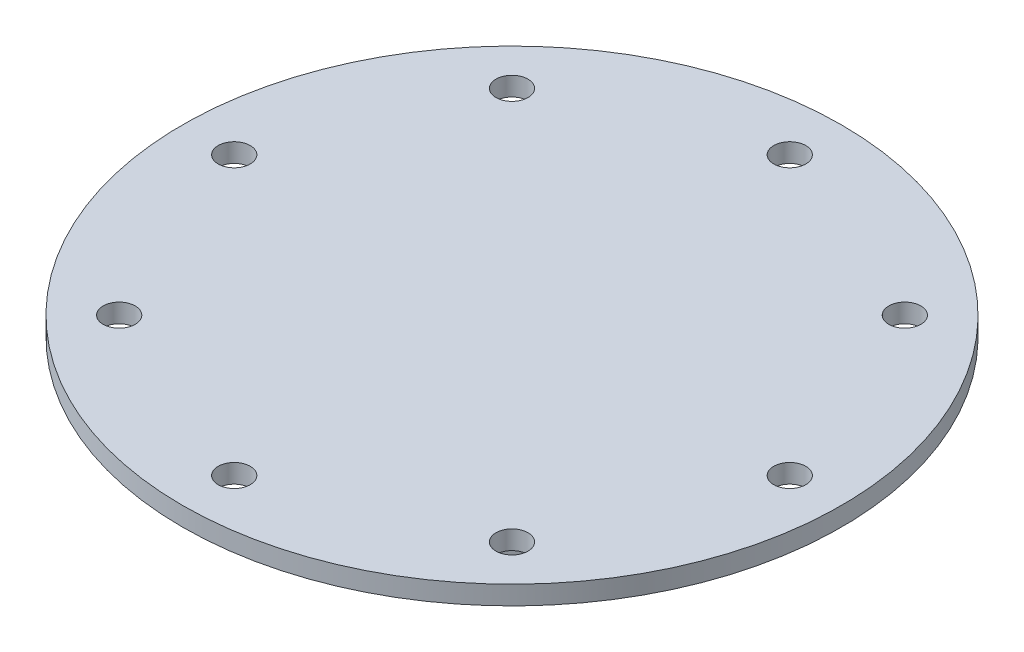
ISO-10303-21;
HEADER;
FILE_DESCRIPTION(('STEP AP214'),'2;1');
FILE_NAME('part.step','',(''),(''),'','','');
FILE_SCHEMA(('AUTOMOTIVE_DESIGN { 1 0 10303 214 1 1 1 1 }'));
ENDSEC;
DATA;
#1=APPLICATION_CONTEXT('core data for automotive mechanical design processes');
#2=APPLICATION_PROTOCOL_DEFINITION('international standard','automotive_design',2000,#1);
#3=PRODUCT_CONTEXT('',#1,'mechanical');
#4=PRODUCT('Part','Part','',(#3));
#5=PRODUCT_RELATED_PRODUCT_CATEGORY('part','',(#4));
#6=PRODUCT_DEFINITION_FORMATION('','',#4);
#7=PRODUCT_DEFINITION_CONTEXT('part definition',#1,'design');
#8=PRODUCT_DEFINITION('design','',#6,#7);
#9=PRODUCT_DEFINITION_SHAPE('','',#8);
#10=(LENGTH_UNIT() NAMED_UNIT(*) SI_UNIT(.MILLI.,.METRE.));
#11=(NAMED_UNIT(*) PLANE_ANGLE_UNIT() SI_UNIT($,.RADIAN.));
#12=(NAMED_UNIT(*) SI_UNIT($,.STERADIAN.) SOLID_ANGLE_UNIT());
#13=UNCERTAINTY_MEASURE_WITH_UNIT(LENGTH_MEASURE(1.E-05),#10,'distance_accuracy_value','');
#14=(GEOMETRIC_REPRESENTATION_CONTEXT(3) GLOBAL_UNCERTAINTY_ASSIGNED_CONTEXT((#13)) GLOBAL_UNIT_ASSIGNED_CONTEXT((#10,
#11,#12)) REPRESENTATION_CONTEXT('',''));
#15=CARTESIAN_POINT('',(0.,0.,0.));
#16=DIRECTION('',(0.,0.,1.));
#17=DIRECTION('',(1.,0.,0.));
#18=AXIS2_PLACEMENT_3D('',#15,#16,#17);
#19=CARTESIAN_POINT('',(0.,4.,0.));
#20=DIRECTION('',(0.,1.,0.));
#21=DIRECTION('',(0.,0.,1.));
#22=AXIS2_PLACEMENT_3D('',#19,#20,#21);
#23=PLANE('',#22);
#24=CARTESIAN_POINT('',(6.17992196975235E-13,4.,-59.));
#25=DIRECTION('',(0.,1.,0.));
#26=DIRECTION('',(0.,0.,1.));
#27=AXIS2_PLACEMENT_3D('',#24,#25,#26);
#28=CIRCLE('',#27,3.4);
#29=CARTESIAN_POINT('',(6.17992196975235E-13,4.,-55.6));
#30=VERTEX_POINT('',#29);
#31=EDGE_CURVE('E92',#30,#30,#28,.T.);
#32=ORIENTED_EDGE('',*,*,#31,.F.);
#33=EDGE_LOOP('',(#32));
#34=FACE_BOUND('',#33,.T.);
#35=CARTESIAN_POINT('',(-59.,4.,-4.1199479798349E-13));
#36=DIRECTION('',(0.,1.,0.));
#37=DIRECTION('',(0.,0.,1.));
#38=AXIS2_PLACEMENT_3D('',#35,#36,#37);
#39=CIRCLE('',#38,3.4);
#40=CARTESIAN_POINT('',(-59.,4.,3.39999999999959));
#41=VERTEX_POINT('',#40);
#42=EDGE_CURVE('E80',#41,#41,#39,.T.);
#43=ORIENTED_EDGE('',*,*,#42,.F.);
#44=EDGE_LOOP('',(#43));
#45=FACE_BOUND('',#44,.T.);
#46=CARTESIAN_POINT('',(-2.05997398991745E-13,4.,59.));
#47=DIRECTION('',(0.,1.,0.));
#48=DIRECTION('',(0.,0.,1.));
#49=AXIS2_PLACEMENT_3D('',#46,#47,#48);
#50=CIRCLE('',#49,3.4);
#51=CARTESIAN_POINT('',(-2.05997398991745E-13,4.,62.4));
#52=VERTEX_POINT('',#51);
#53=EDGE_CURVE('E68',#52,#52,#50,.T.);
#54=ORIENTED_EDGE('',*,*,#53,.F.);
#55=EDGE_LOOP('',(#54));
#56=FACE_BOUND('',#55,.T.);
#57=CARTESIAN_POINT('',(59.,4.,0.));
#58=DIRECTION('',(0.,1.,0.));
#59=DIRECTION('',(0.,0.,1.));
#60=AXIS2_PLACEMENT_3D('',#57,#58,#59);
#61=CIRCLE('',#60,3.4);
#62=CARTESIAN_POINT('',(59.,4.,3.4));
#63=VERTEX_POINT('',#62);
#64=EDGE_CURVE('E56',#63,#63,#61,.T.);
#65=ORIENTED_EDGE('',*,*,#64,.F.);
#66=EDGE_LOOP('',(#65));
#67=FACE_BOUND('',#66,.T.);
#68=CARTESIAN_POINT('',(0.,4.,0.));
#69=DIRECTION('',(0.,1.,0.));
#70=DIRECTION('',(0.,0.,1.));
#71=AXIS2_PLACEMENT_3D('',#68,#69,#70);
#72=CIRCLE('',#71,70.);
#73=CARTESIAN_POINT('',(0.,4.,70.));
#74=VERTEX_POINT('',#73);
#75=EDGE_CURVE('E52',#74,#74,#72,.T.);
#76=ORIENTED_EDGE('',*,*,#75,.T.);
#77=EDGE_LOOP('',(#76));
#78=FACE_BOUND('',#77,.T.);
#79=CARTESIAN_POINT('',(41.7193000900062,4.,41.7193000900064));
#80=DIRECTION('',(0.,1.,0.));
#81=DIRECTION('',(0.,0.,1.));
#82=AXIS2_PLACEMENT_3D('',#79,#80,#81);
#83=CIRCLE('',#82,3.4);
#84=CARTESIAN_POINT('',(41.7193000900062,4.,45.1193000900064));
#85=VERTEX_POINT('',#84);
#86=EDGE_CURVE('E62',#85,#85,#83,.T.);
#87=ORIENTED_EDGE('',*,*,#86,.F.);
#88=EDGE_LOOP('',(#87));
#89=FACE_BOUND('',#88,.T.);
#90=CARTESIAN_POINT('',(-41.7193000900065,4.,41.7193000900061));
#91=DIRECTION('',(0.,1.,0.));
#92=DIRECTION('',(0.,0.,1.));
#93=AXIS2_PLACEMENT_3D('',#90,#91,#92);
#94=CIRCLE('',#93,3.4);
#95=CARTESIAN_POINT('',(-41.7193000900065,4.,45.1193000900061));
#96=VERTEX_POINT('',#95);
#97=EDGE_CURVE('E74',#96,#96,#94,.T.);
#98=ORIENTED_EDGE('',*,*,#97,.F.);
#99=EDGE_LOOP('',(#98));
#100=FACE_BOUND('',#99,.T.);
#101=CARTESIAN_POINT('',(-41.7193000900059,4.,-41.7193000900067));
#102=DIRECTION('',(0.,1.,0.));
#103=DIRECTION('',(0.,0.,1.));
#104=AXIS2_PLACEMENT_3D('',#101,#102,#103);
#105=CIRCLE('',#104,3.4);
#106=CARTESIAN_POINT('',(-41.7193000900059,4.,-38.3193000900067));
#107=VERTEX_POINT('',#106);
#108=EDGE_CURVE('E86',#107,#107,#105,.T.);
#109=ORIENTED_EDGE('',*,*,#108,.F.);
#110=EDGE_LOOP('',(#109));
#111=FACE_BOUND('',#110,.T.);
#112=CARTESIAN_POINT('',(41.7193000900068,4.,-41.7193000900058));
#113=DIRECTION('',(0.,1.,0.));
#114=DIRECTION('',(0.,0.,1.));
#115=AXIS2_PLACEMENT_3D('',#112,#113,#114);
#116=CIRCLE('',#115,3.4);
#117=CARTESIAN_POINT('',(41.7193000900068,4.,-38.3193000900058));
#118=VERTEX_POINT('',#117);
#119=EDGE_CURVE('E98',#118,#118,#116,.T.);
#120=ORIENTED_EDGE('',*,*,#119,.F.);
#121=EDGE_LOOP('',(#120));
#122=FACE_BOUND('',#121,.T.);
#123=ADVANCED_FACE('F32',(#34,#45,#56,#67,#78,#89,#100,#111,#122),#23,.T.);
#124=CARTESIAN_POINT('',(0.,0.,0.));
#125=DIRECTION('',(0.,1.,0.));
#126=DIRECTION('',(0.,0.,1.));
#127=AXIS2_PLACEMENT_3D('',#124,#125,#126);
#128=PLANE('',#127);
#129=CARTESIAN_POINT('',(0.,0.,0.));
#130=DIRECTION('',(0.,1.,0.));
#131=DIRECTION('',(0.,0.,1.));
#132=AXIS2_PLACEMENT_3D('',#129,#130,#131);
#133=CIRCLE('',#132,41.);
#134=CARTESIAN_POINT('',(0.,0.,41.));
#135=VERTEX_POINT('',#134);
#136=EDGE_CURVE('E47',#135,#135,#133,.T.);
#137=ORIENTED_EDGE('',*,*,#136,.T.);
#138=EDGE_LOOP('',(#137));
#139=FACE_BOUND('',#138,.T.);
#140=CARTESIAN_POINT('',(0.,0.,0.));
#141=DIRECTION('',(0.,1.,0.));
#142=DIRECTION('',(0.,0.,1.));
#143=AXIS2_PLACEMENT_3D('',#140,#141,#142);
#144=CIRCLE('',#143,70.);
#145=CARTESIAN_POINT('',(0.,0.,70.));
#146=VERTEX_POINT('',#145);
#147=EDGE_CURVE('E53',#146,#146,#144,.T.);
#148=ORIENTED_EDGE('',*,*,#147,.F.);
#149=EDGE_LOOP('',(#148));
#150=FACE_BOUND('',#149,.T.);
#151=CARTESIAN_POINT('',(59.,0.,0.));
#152=DIRECTION('',(0.,1.,0.));
#153=DIRECTION('',(0.,0.,1.));
#154=AXIS2_PLACEMENT_3D('',#151,#152,#153);
#155=CIRCLE('',#154,3.4);
#156=CARTESIAN_POINT('',(59.,0.,3.4));
#157=VERTEX_POINT('',#156);
#158=EDGE_CURVE('E59',#157,#157,#155,.T.);
#159=ORIENTED_EDGE('',*,*,#158,.T.);
#160=EDGE_LOOP('',(#159));
#161=FACE_BOUND('',#160,.T.);
#162=CARTESIAN_POINT('',(41.7193000900062,0.,41.7193000900064));
#163=DIRECTION('',(0.,1.,0.));
#164=DIRECTION('',(0.,0.,1.));
#165=AXIS2_PLACEMENT_3D('',#162,#163,#164);
#166=CIRCLE('',#165,3.4);
#167=CARTESIAN_POINT('',(41.7193000900062,0.,45.1193000900064));
#168=VERTEX_POINT('',#167);
#169=EDGE_CURVE('E65',#168,#168,#166,.T.);
#170=ORIENTED_EDGE('',*,*,#169,.T.);
#171=EDGE_LOOP('',(#170));
#172=FACE_BOUND('',#171,.T.);
#173=CARTESIAN_POINT('',(-2.05997398991745E-13,0.,59.));
#174=DIRECTION('',(0.,1.,0.));
#175=DIRECTION('',(0.,0.,1.));
#176=AXIS2_PLACEMENT_3D('',#173,#174,#175);
#177=CIRCLE('',#176,3.4);
#178=CARTESIAN_POINT('',(-2.05997398991745E-13,0.,62.4));
#179=VERTEX_POINT('',#178);
#180=EDGE_CURVE('E71',#179,#179,#177,.T.);
#181=ORIENTED_EDGE('',*,*,#180,.T.);
#182=EDGE_LOOP('',(#181));
#183=FACE_BOUND('',#182,.T.);
#184=CARTESIAN_POINT('',(-41.7193000900065,0.,41.7193000900061));
#185=DIRECTION('',(0.,1.,0.));
#186=DIRECTION('',(0.,0.,1.));
#187=AXIS2_PLACEMENT_3D('',#184,#185,#186);
#188=CIRCLE('',#187,3.4);
#189=CARTESIAN_POINT('',(-41.7193000900065,0.,45.1193000900061));
#190=VERTEX_POINT('',#189);
#191=EDGE_CURVE('E77',#190,#190,#188,.T.);
#192=ORIENTED_EDGE('',*,*,#191,.T.);
#193=EDGE_LOOP('',(#192));
#194=FACE_BOUND('',#193,.T.);
#195=CARTESIAN_POINT('',(-59.,0.,-4.1199479798349E-13));
#196=DIRECTION('',(0.,1.,0.));
#197=DIRECTION('',(0.,0.,1.));
#198=AXIS2_PLACEMENT_3D('',#195,#196,#197);
#199=CIRCLE('',#198,3.4);
#200=CARTESIAN_POINT('',(-59.,0.,3.39999999999959));
#201=VERTEX_POINT('',#200);
#202=EDGE_CURVE('E83',#201,#201,#199,.T.);
#203=ORIENTED_EDGE('',*,*,#202,.T.);
#204=EDGE_LOOP('',(#203));
#205=FACE_BOUND('',#204,.T.);
#206=CARTESIAN_POINT('',(-41.7193000900059,0.,-41.7193000900067));
#207=DIRECTION('',(0.,1.,0.));
#208=DIRECTION('',(0.,0.,1.));
#209=AXIS2_PLACEMENT_3D('',#206,#207,#208);
#210=CIRCLE('',#209,3.4);
#211=CARTESIAN_POINT('',(-41.7193000900059,0.,-38.3193000900067));
#212=VERTEX_POINT('',#211);
#213=EDGE_CURVE('E89',#212,#212,#210,.T.);
#214=ORIENTED_EDGE('',*,*,#213,.T.);
#215=EDGE_LOOP('',(#214));
#216=FACE_BOUND('',#215,.T.);
#217=CARTESIAN_POINT('',(6.17992196975235E-13,0.,-59.));
#218=DIRECTION('',(0.,1.,0.));
#219=DIRECTION('',(0.,0.,1.));
#220=AXIS2_PLACEMENT_3D('',#217,#218,#219);
#221=CIRCLE('',#220,3.4);
#222=CARTESIAN_POINT('',(6.17992196975235E-13,0.,-55.6));
#223=VERTEX_POINT('',#222);
#224=EDGE_CURVE('E95',#223,#223,#221,.T.);
#225=ORIENTED_EDGE('',*,*,#224,.T.);
#226=EDGE_LOOP('',(#225));
#227=FACE_BOUND('',#226,.T.);
#228=CARTESIAN_POINT('',(41.7193000900068,0.,-41.7193000900058));
#229=DIRECTION('',(0.,1.,0.));
#230=DIRECTION('',(0.,0.,1.));
#231=AXIS2_PLACEMENT_3D('',#228,#229,#230);
#232=CIRCLE('',#231,3.4);
#233=CARTESIAN_POINT('',(41.7193000900068,0.,-38.3193000900058));
#234=VERTEX_POINT('',#233);
#235=EDGE_CURVE('E101',#234,#234,#232,.T.);
#236=ORIENTED_EDGE('',*,*,#235,.T.);
#237=EDGE_LOOP('',(#236));
#238=FACE_BOUND('',#237,.T.);
#239=ADVANCED_FACE('F126',(#139,#150,#161,#172,#183,#194,#205,#216,#227,#238),#128,.F.);
#240=CARTESIAN_POINT('',(0.,4.,0.));
#241=DIRECTION('',(0.,-1.,0.));
#242=DIRECTION('',(0.,0.,-1.));
#243=AXIS2_PLACEMENT_3D('',#240,#241,#242);
#244=CYLINDRICAL_SURFACE('',#243,70.);
#245=ORIENTED_EDGE('',*,*,#75,.F.);
#246=EDGE_LOOP('',(#245));
#247=FACE_BOUND('',#246,.T.);
#248=ORIENTED_EDGE('',*,*,#147,.T.);
#249=EDGE_LOOP('',(#248));
#250=FACE_BOUND('',#249,.T.);
#251=ADVANCED_FACE('F135',(#247,#250),#244,.T.);
#252=CARTESIAN_POINT('',(59.,4.,0.));
#253=DIRECTION('',(0.,-1.,0.));
#254=DIRECTION('',(0.,0.,-1.));
#255=AXIS2_PLACEMENT_3D('',#252,#253,#254);
#256=CYLINDRICAL_SURFACE('',#255,3.4);
#257=ORIENTED_EDGE('',*,*,#64,.T.);
#258=EDGE_LOOP('',(#257));
#259=FACE_BOUND('',#258,.T.);
#260=ORIENTED_EDGE('',*,*,#158,.F.);
#261=EDGE_LOOP('',(#260));
#262=FACE_BOUND('',#261,.T.);
#263=ADVANCED_FACE('F140',(#259,#262),#256,.F.);
#264=CARTESIAN_POINT('',(41.7193000900062,4.,41.7193000900064));
#265=DIRECTION('',(0.,-1.,0.));
#266=DIRECTION('',(0.,0.,-1.));
#267=AXIS2_PLACEMENT_3D('',#264,#265,#266);
#268=CYLINDRICAL_SURFACE('',#267,3.4);
#269=ORIENTED_EDGE('',*,*,#86,.T.);
#270=EDGE_LOOP('',(#269));
#271=FACE_BOUND('',#270,.T.);
#272=ORIENTED_EDGE('',*,*,#169,.F.);
#273=EDGE_LOOP('',(#272));
#274=FACE_BOUND('',#273,.T.);
#275=ADVANCED_FACE('F201',(#271,#274),#268,.F.);
#276=CARTESIAN_POINT('',(-2.05997398991745E-13,4.,59.));
#277=DIRECTION('',(0.,-1.,0.));
#278=DIRECTION('',(0.,0.,-1.));
#279=AXIS2_PLACEMENT_3D('',#276,#277,#278);
#280=CYLINDRICAL_SURFACE('',#279,3.4);
#281=ORIENTED_EDGE('',*,*,#53,.T.);
#282=EDGE_LOOP('',(#281));
#283=FACE_BOUND('',#282,.T.);
#284=ORIENTED_EDGE('',*,*,#180,.F.);
#285=EDGE_LOOP('',(#284));
#286=FACE_BOUND('',#285,.T.);
#287=ADVANCED_FACE('F198',(#283,#286),#280,.F.);
#288=CARTESIAN_POINT('',(-41.7193000900065,4.,41.7193000900061));
#289=DIRECTION('',(0.,-1.,0.));
#290=DIRECTION('',(0.,0.,-1.));
#291=AXIS2_PLACEMENT_3D('',#288,#289,#290);
#292=CYLINDRICAL_SURFACE('',#291,3.4);
#293=ORIENTED_EDGE('',*,*,#97,.T.);
#294=EDGE_LOOP('',(#293));
#295=FACE_BOUND('',#294,.T.);
#296=ORIENTED_EDGE('',*,*,#191,.F.);
#297=EDGE_LOOP('',(#296));
#298=FACE_BOUND('',#297,.T.);
#299=ADVANCED_FACE('F194',(#295,#298),#292,.F.);
#300=CARTESIAN_POINT('',(-59.,4.,-4.1199479798349E-13));
#301=DIRECTION('',(0.,-1.,0.));
#302=DIRECTION('',(0.,0.,-1.));
#303=AXIS2_PLACEMENT_3D('',#300,#301,#302);
#304=CYLINDRICAL_SURFACE('',#303,3.4);
#305=ORIENTED_EDGE('',*,*,#42,.T.);
#306=EDGE_LOOP('',(#305));
#307=FACE_BOUND('',#306,.T.);
#308=ORIENTED_EDGE('',*,*,#202,.F.);
#309=EDGE_LOOP('',(#308));
#310=FACE_BOUND('',#309,.T.);
#311=ADVANCED_FACE('F190',(#307,#310),#304,.F.);
#312=CARTESIAN_POINT('',(-41.7193000900059,4.,-41.7193000900067));
#313=DIRECTION('',(0.,-1.,0.));
#314=DIRECTION('',(0.,0.,-1.));
#315=AXIS2_PLACEMENT_3D('',#312,#313,#314);
#316=CYLINDRICAL_SURFACE('',#315,3.4);
#317=ORIENTED_EDGE('',*,*,#108,.T.);
#318=EDGE_LOOP('',(#317));
#319=FACE_BOUND('',#318,.T.);
#320=ORIENTED_EDGE('',*,*,#213,.F.);
#321=EDGE_LOOP('',(#320));
#322=FACE_BOUND('',#321,.T.);
#323=ADVANCED_FACE('F184',(#319,#322),#316,.F.);
#324=CARTESIAN_POINT('',(6.17992196975235E-13,4.,-59.));
#325=DIRECTION('',(0.,-1.,0.));
#326=DIRECTION('',(0.,0.,-1.));
#327=AXIS2_PLACEMENT_3D('',#324,#325,#326);
#328=CYLINDRICAL_SURFACE('',#327,3.4);
#329=ORIENTED_EDGE('',*,*,#31,.T.);
#330=EDGE_LOOP('',(#329));
#331=FACE_BOUND('',#330,.T.);
#332=ORIENTED_EDGE('',*,*,#224,.F.);
#333=EDGE_LOOP('',(#332));
#334=FACE_BOUND('',#333,.T.);
#335=ADVANCED_FACE('F175',(#331,#334),#328,.F.);
#336=CARTESIAN_POINT('',(41.7193000900068,4.,-41.7193000900058));
#337=DIRECTION('',(0.,-1.,0.));
#338=DIRECTION('',(0.,0.,-1.));
#339=AXIS2_PLACEMENT_3D('',#336,#337,#338);
#340=CYLINDRICAL_SURFACE('',#339,3.4);
#341=ORIENTED_EDGE('',*,*,#119,.T.);
#342=EDGE_LOOP('',(#341));
#343=FACE_BOUND('',#342,.T.);
#344=ORIENTED_EDGE('',*,*,#235,.F.);
#345=EDGE_LOOP('',(#344));
#346=FACE_BOUND('',#345,.T.);
#347=ADVANCED_FACE('F173',(#343,#346),#340,.F.);
#348=CARTESIAN_POINT('',(0.,-21.,0.));
#349=DIRECTION('',(0.,1.,0.));
#350=DIRECTION('',(0.,0.,1.));
#351=AXIS2_PLACEMENT_3D('',#348,#349,#350);
#352=CYLINDRICAL_SURFACE('',#351,40.);
#353=CARTESIAN_POINT('',(0.,-1.,0.));
#354=DIRECTION('',(0.,1.,0.));
#355=DIRECTION('',(0.,0.,1.));
#356=AXIS2_PLACEMENT_3D('',#353,#354,#355);
#357=CIRCLE('',#356,40.);
#358=CARTESIAN_POINT('',(0.,-1.,40.));
#359=VERTEX_POINT('',#358);
#360=EDGE_CURVE('E43',#359,#359,#357,.F.);
#361=CARTESIAN_POINT('',(0.,-21.,0.));
#362=DIRECTION('',(0.,1.,0.));
#363=DIRECTION('',(0.,0.,1.));
#364=AXIS2_PLACEMENT_3D('',#361,#362,#363);
#365=CIRCLE('',#364,40.);
#366=CARTESIAN_POINT('',(0.,-21.,40.));
#367=VERTEX_POINT('',#366);
#368=EDGE_CURVE('E104',#367,#367,#365,.T.);
#369=CARTESIAN_POINT('',(0.,-1.,40.));
#370=CARTESIAN_POINT('',(0.,-1.20833333333333,40.));
#371=CARTESIAN_POINT('',(0.,-1.41666666666667,40.));
#372=CARTESIAN_POINT('',(0.,-1.83333333333334,40.));
#373=CARTESIAN_POINT('',(0.,-2.04166666666667,40.));
#374=CARTESIAN_POINT('',(0.,-2.45833333333334,40.));
#375=CARTESIAN_POINT('',(0.,-2.66666666666667,40.));
#376=CARTESIAN_POINT('',(0.,-3.08333333333334,40.));
#377=CARTESIAN_POINT('',(0.,-3.29166666666667,40.));
#378=CARTESIAN_POINT('',(0.,-3.70833333333334,40.));
#379=CARTESIAN_POINT('',(0.,-3.91666666666667,40.));
#380=CARTESIAN_POINT('',(0.,-4.33333333333334,40.));
#381=CARTESIAN_POINT('',(0.,-4.54166666666667,40.));
#382=CARTESIAN_POINT('',(0.,-4.95833333333334,40.));
#383=CARTESIAN_POINT('',(0.,-5.16666666666667,40.));
#384=CARTESIAN_POINT('',(0.,-5.58333333333333,40.));
#385=CARTESIAN_POINT('',(0.,-5.79166666666667,40.));
#386=CARTESIAN_POINT('',(0.,-6.20833333333333,40.));
#387=CARTESIAN_POINT('',(0.,-6.41666666666667,40.));
#388=CARTESIAN_POINT('',(0.,-6.83333333333333,40.));
#389=CARTESIAN_POINT('',(0.,-7.04166666666667,40.));
#390=CARTESIAN_POINT('',(0.,-7.45833333333333,40.));
#391=CARTESIAN_POINT('',(0.,-7.66666666666667,40.));
#392=CARTESIAN_POINT('',(0.,-8.08333333333333,40.));
#393=CARTESIAN_POINT('',(0.,-8.29166666666667,40.));
#394=CARTESIAN_POINT('',(0.,-8.70833333333334,40.));
#395=CARTESIAN_POINT('',(0.,-8.91666666666667,40.));
#396=CARTESIAN_POINT('',(0.,-9.33333333333334,40.));
#397=CARTESIAN_POINT('',(0.,-9.54166666666667,40.));
#398=CARTESIAN_POINT('',(0.,-9.95833333333333,40.));
#399=CARTESIAN_POINT('',(0.,-10.1666666666667,40.));
#400=CARTESIAN_POINT('',(0.,-10.5833333333333,40.));
#401=CARTESIAN_POINT('',(0.,-10.7916666666667,40.));
#402=CARTESIAN_POINT('',(0.,-11.2083333333333,40.));
#403=CARTESIAN_POINT('',(0.,-11.4166666666667,40.));
#404=CARTESIAN_POINT('',(0.,-11.8333333333333,40.));
#405=CARTESIAN_POINT('',(0.,-12.0416666666667,40.));
#406=CARTESIAN_POINT('',(0.,-12.4583333333333,40.));
#407=CARTESIAN_POINT('',(0.,-12.6666666666667,40.));
#408=CARTESIAN_POINT('',(0.,-13.0833333333333,40.));
#409=CARTESIAN_POINT('',(0.,-13.2916666666667,40.));
#410=CARTESIAN_POINT('',(0.,-13.7083333333333,40.));
#411=CARTESIAN_POINT('',(0.,-13.9166666666667,40.));
#412=CARTESIAN_POINT('',(0.,-14.3333333333333,40.));
#413=CARTESIAN_POINT('',(0.,-14.5416666666667,40.));
#414=CARTESIAN_POINT('',(0.,-14.9583333333333,40.));
#415=CARTESIAN_POINT('',(0.,-15.1666666666667,40.));
#416=CARTESIAN_POINT('',(0.,-15.5833333333333,40.));
#417=CARTESIAN_POINT('',(0.,-15.7916666666667,40.));
#418=CARTESIAN_POINT('',(0.,-16.2083333333333,40.));
#419=CARTESIAN_POINT('',(0.,-16.4166666666667,40.));
#420=CARTESIAN_POINT('',(0.,-16.8333333333333,40.));
#421=CARTESIAN_POINT('',(0.,-17.0416666666667,40.));
#422=CARTESIAN_POINT('',(0.,-17.4583333333333,40.));
#423=CARTESIAN_POINT('',(0.,-17.6666666666667,40.));
#424=CARTESIAN_POINT('',(0.,-18.0833333333333,40.));
#425=CARTESIAN_POINT('',(0.,-18.2916666666667,40.));
#426=CARTESIAN_POINT('',(0.,-18.7083333333333,40.));
#427=CARTESIAN_POINT('',(0.,-18.9166666666667,40.));
#428=CARTESIAN_POINT('',(0.,-19.3333333333333,40.));
#429=CARTESIAN_POINT('',(0.,-19.5416666666667,40.));
#430=CARTESIAN_POINT('',(0.,-19.9583333333333,40.));
#431=CARTESIAN_POINT('',(0.,-20.1666666666667,40.));
#432=CARTESIAN_POINT('',(0.,-20.5833333333333,40.));
#433=CARTESIAN_POINT('',(0.,-20.7916666666667,40.));
#434=CARTESIAN_POINT('',(0.,-21.,40.));
#435=B_SPLINE_CURVE_WITH_KNOTS('',3,(#369,#370,#371,#372,#373,#374,#375,#376,#377,#378,#379,
#380,#381,#382,#383,#384,#385,#386,#387,#388,#389,#390,#391,#392,#393,#394,#395,#396,#397,#398,
#399,#400,#401,#402,#403,#404,#405,#406,#407,#408,#409,#410,#411,#412,#413,#414,#415,#416,#417,
#418,#419,#420,#421,#422,#423,#424,#425,#426,#427,#428,#429,#430,#431,#432,#433,#434),
.UNSPECIFIED.,.F.,.F.,(4,2,2,2,2,2,2,2,2,2,2,2,2,2,2,2,2,2,2,2,2,2,2,2,2,2,2,2,2,2,2,2,4),(0.,
0.625000000000001,1.25,1.875,2.5,3.125,3.75,4.375,5.,5.625,6.25,6.875,7.5,8.125,8.75,9.375,10.,
10.625,11.25,11.875,12.5,13.125,13.75,14.375,15.,15.625,16.25,16.875,17.5,18.125,18.75,19.375,
20.),.UNSPECIFIED.);
#436=EDGE_CURVE('BSEAM127',#359,#367,#435,.T.);
#437=ORIENTED_EDGE('',*,*,#360,.T.);
#438=ORIENTED_EDGE('',*,*,#368,.T.);
#439=ORIENTED_EDGE('',*,*,#436,.T.);
#440=ORIENTED_EDGE('',*,*,#436,.F.);
#441=EDGE_LOOP('',(#437,#439,#438,#440));
#442=FACE_BOUND('',#441,.T.);
#443=ADVANCED_FACE('F127',(#442),#352,.T.);
#444=CARTESIAN_POINT('',(0.,-21.,0.));
#445=DIRECTION('',(0.,1.,0.));
#446=DIRECTION('',(0.,0.,1.));
#447=AXIS2_PLACEMENT_3D('',#444,#445,#446);
#448=PLANE('',#447);
#449=CARTESIAN_POINT('',(0.,-21.,0.));
#450=DIRECTION('',(0.,1.,0.));
#451=DIRECTION('',(0.,0.,1.));
#452=AXIS2_PLACEMENT_3D('',#449,#450,#451);
#453=CIRCLE('',#452,35.);
#454=CARTESIAN_POINT('',(0.,-21.,35.));
#455=VERTEX_POINT('',#454);
#456=EDGE_CURVE('E109',#455,#455,#453,.T.);
#457=ORIENTED_EDGE('',*,*,#456,.T.);
#458=EDGE_LOOP('',(#457));
#459=FACE_BOUND('',#458,.T.);
#460=ORIENTED_EDGE('',*,*,#368,.F.);
#461=EDGE_LOOP('',(#460));
#462=FACE_BOUND('',#461,.T.);
#463=ADVANCED_FACE('F113',(#459,#462),#448,.F.);
#464=CARTESIAN_POINT('',(0.,-21.,0.));
#465=DIRECTION('',(0.,1.,0.));
#466=DIRECTION('',(0.,0.,1.));
#467=AXIS2_PLACEMENT_3D('',#464,#465,#466);
#468=CYLINDRICAL_SURFACE('',#467,35.);
#469=CARTESIAN_POINT('',(0.,-1.,0.));
#470=DIRECTION('',(0.,1.,0.));
#471=DIRECTION('',(0.,0.,1.));
#472=AXIS2_PLACEMENT_3D('',#469,#470,#471);
#473=CIRCLE('',#472,35.);
#474=CARTESIAN_POINT('',(0.,-1.,35.));
#475=VERTEX_POINT('',#474);
#476=EDGE_CURVE('E39',#475,#475,#473,.T.);
#477=CARTESIAN_POINT('',(0.,-1.,35.));
#478=CARTESIAN_POINT('',(0.,-1.20833333333333,35.));
#479=CARTESIAN_POINT('',(0.,-1.41666666666667,35.));
#480=CARTESIAN_POINT('',(0.,-1.83333333333334,35.));
#481=CARTESIAN_POINT('',(0.,-2.04166666666667,35.));
#482=CARTESIAN_POINT('',(0.,-2.45833333333334,35.));
#483=CARTESIAN_POINT('',(0.,-2.66666666666667,35.));
#484=CARTESIAN_POINT('',(0.,-3.08333333333334,35.));
#485=CARTESIAN_POINT('',(0.,-3.29166666666667,35.));
#486=CARTESIAN_POINT('',(0.,-3.70833333333334,35.));
#487=CARTESIAN_POINT('',(0.,-3.91666666666667,35.));
#488=CARTESIAN_POINT('',(0.,-4.33333333333334,35.));
#489=CARTESIAN_POINT('',(0.,-4.54166666666667,35.));
#490=CARTESIAN_POINT('',(0.,-4.95833333333334,35.));
#491=CARTESIAN_POINT('',(0.,-5.16666666666667,35.));
#492=CARTESIAN_POINT('',(0.,-5.58333333333333,35.));
#493=CARTESIAN_POINT('',(0.,-5.79166666666667,35.));
#494=CARTESIAN_POINT('',(0.,-6.20833333333333,35.));
#495=CARTESIAN_POINT('',(0.,-6.41666666666667,35.));
#496=CARTESIAN_POINT('',(0.,-6.83333333333333,35.));
#497=CARTESIAN_POINT('',(0.,-7.04166666666667,35.));
#498=CARTESIAN_POINT('',(0.,-7.45833333333333,35.));
#499=CARTESIAN_POINT('',(0.,-7.66666666666667,35.));
#500=CARTESIAN_POINT('',(0.,-8.08333333333333,35.));
#501=CARTESIAN_POINT('',(0.,-8.29166666666667,35.));
#502=CARTESIAN_POINT('',(0.,-8.70833333333334,35.));
#503=CARTESIAN_POINT('',(0.,-8.91666666666667,35.));
#504=CARTESIAN_POINT('',(0.,-9.33333333333334,35.));
#505=CARTESIAN_POINT('',(0.,-9.54166666666667,35.));
#506=CARTESIAN_POINT('',(0.,-9.95833333333333,35.));
#507=CARTESIAN_POINT('',(0.,-10.1666666666667,35.));
#508=CARTESIAN_POINT('',(0.,-10.5833333333333,35.));
#509=CARTESIAN_POINT('',(0.,-10.7916666666667,35.));
#510=CARTESIAN_POINT('',(0.,-11.2083333333333,35.));
#511=CARTESIAN_POINT('',(0.,-11.4166666666667,35.));
#512=CARTESIAN_POINT('',(0.,-11.8333333333333,35.));
#513=CARTESIAN_POINT('',(0.,-12.0416666666667,35.));
#514=CARTESIAN_POINT('',(0.,-12.4583333333333,35.));
#515=CARTESIAN_POINT('',(0.,-12.6666666666667,35.));
#516=CARTESIAN_POINT('',(0.,-13.0833333333333,35.));
#517=CARTESIAN_POINT('',(0.,-13.2916666666667,35.));
#518=CARTESIAN_POINT('',(0.,-13.7083333333333,35.));
#519=CARTESIAN_POINT('',(0.,-13.9166666666667,35.));
#520=CARTESIAN_POINT('',(0.,-14.3333333333333,35.));
#521=CARTESIAN_POINT('',(0.,-14.5416666666667,35.));
#522=CARTESIAN_POINT('',(0.,-14.9583333333333,35.));
#523=CARTESIAN_POINT('',(0.,-15.1666666666667,35.));
#524=CARTESIAN_POINT('',(0.,-15.5833333333333,35.));
#525=CARTESIAN_POINT('',(0.,-15.7916666666667,35.));
#526=CARTESIAN_POINT('',(0.,-16.2083333333333,35.));
#527=CARTESIAN_POINT('',(0.,-16.4166666666667,35.));
#528=CARTESIAN_POINT('',(0.,-16.8333333333333,35.));
#529=CARTESIAN_POINT('',(0.,-17.0416666666667,35.));
#530=CARTESIAN_POINT('',(0.,-17.4583333333333,35.));
#531=CARTESIAN_POINT('',(0.,-17.6666666666667,35.));
#532=CARTESIAN_POINT('',(0.,-18.0833333333333,35.));
#533=CARTESIAN_POINT('',(0.,-18.2916666666667,35.));
#534=CARTESIAN_POINT('',(0.,-18.7083333333333,35.));
#535=CARTESIAN_POINT('',(0.,-18.9166666666667,35.));
#536=CARTESIAN_POINT('',(0.,-19.3333333333333,35.));
#537=CARTESIAN_POINT('',(0.,-19.5416666666667,35.));
#538=CARTESIAN_POINT('',(0.,-19.9583333333333,35.));
#539=CARTESIAN_POINT('',(0.,-20.1666666666667,35.));
#540=CARTESIAN_POINT('',(0.,-20.5833333333333,35.));
#541=CARTESIAN_POINT('',(0.,-20.7916666666667,35.));
#542=CARTESIAN_POINT('',(0.,-21.,35.));
#543=B_SPLINE_CURVE_WITH_KNOTS('',3,(#477,#478,#479,#480,#481,#482,#483,#484,#485,#486,#487,
#488,#489,#490,#491,#492,#493,#494,#495,#496,#497,#498,#499,#500,#501,#502,#503,#504,#505,#506,
#507,#508,#509,#510,#511,#512,#513,#514,#515,#516,#517,#518,#519,#520,#521,#522,#523,#524,#525,
#526,#527,#528,#529,#530,#531,#532,#533,#534,#535,#536,#537,#538,#539,#540,#541,#542),
.UNSPECIFIED.,.F.,.F.,(4,2,2,2,2,2,2,2,2,2,2,2,2,2,2,2,2,2,2,2,2,2,2,2,2,2,2,2,2,2,2,2,4),(0.,
0.625000000000001,1.25,1.875,2.5,3.125,3.75,4.375,5.,5.625,6.25,6.875,7.5,8.125,8.75,9.375,10.,
10.625,11.25,11.875,12.5,13.125,13.75,14.375,15.,15.625,16.25,16.875,17.5,18.125,18.75,19.375,
20.),.UNSPECIFIED.);
#544=EDGE_CURVE('BSEAM116',#475,#455,#543,.T.);
#545=ORIENTED_EDGE('',*,*,#476,.T.);
#546=ORIENTED_EDGE('',*,*,#456,.F.);
#547=ORIENTED_EDGE('',*,*,#544,.T.);
#548=ORIENTED_EDGE('',*,*,#544,.F.);
#549=EDGE_LOOP('',(#545,#547,#546,#548));
#550=FACE_BOUND('',#549,.T.);
#551=ADVANCED_FACE('F116',(#550),#468,.F.);
#552=CARTESIAN_POINT('',(0.,0.,0.));
#553=DIRECTION('',(0.,1.,0.));
#554=DIRECTION('',(0.,0.,1.));
#555=AXIS2_PLACEMENT_3D('',#552,#553,#554);
#556=CIRCLE('',#555,34.);
#557=CARTESIAN_POINT('',(0.,0.,34.));
#558=VERTEX_POINT('',#557);
#559=EDGE_CURVE('E10',#558,#558,#556,.F.);
#560=ORIENTED_EDGE('',*,*,#559,.T.);
#561=EDGE_LOOP('',(#560));
#562=FACE_BOUND('',#561,.T.);
#563=ADVANCED_FACE('F118',(#562),#128,.F.);
#564=CARTESIAN_POINT('',(0.,-1.,0.));
#565=DIRECTION('',(0.,1.,0.));
#566=DIRECTION('',(0.,0.,1.));
#567=AXIS2_PLACEMENT_3D('',#564,#565,#566);
#568=TOROIDAL_SURFACE('',#567,41.,1.);
#569=ORIENTED_EDGE('',*,*,#360,.F.);
#570=EDGE_LOOP('',(#569));
#571=FACE_BOUND('',#570,.T.);
#572=ORIENTED_EDGE('',*,*,#136,.F.);
#573=EDGE_LOOP('',(#572));
#574=FACE_BOUND('',#573,.T.);
#575=ADVANCED_FACE('F124',(#571,#574),#568,.F.);
#576=CARTESIAN_POINT('',(0.,-1.,0.));
#577=DIRECTION('',(0.,1.,0.));
#578=DIRECTION('',(0.,0.,1.));
#579=AXIS2_PLACEMENT_3D('',#576,#577,#578);
#580=TOROIDAL_SURFACE('',#579,34.,1.);
#581=ORIENTED_EDGE('',*,*,#559,.F.);
#582=EDGE_LOOP('',(#581));
#583=FACE_BOUND('',#582,.T.);
#584=ORIENTED_EDGE('',*,*,#476,.F.);
#585=EDGE_LOOP('',(#584));
#586=FACE_BOUND('',#585,.T.);
#587=ADVANCED_FACE('F34',(#583,#586),#580,.F.);
#588=CLOSED_SHELL('',(#123,#239,#251,#263,#275,#287,#299,#311,#323,#335,#347,#443,#463,#551,
#563,#575,#587));
#589=MANIFOLD_SOLID_BREP('B2',#588);
#590=ADVANCED_BREP_SHAPE_REPRESENTATION('',(#18,#589),#14);
#591=SHAPE_DEFINITION_REPRESENTATION(#9,#590);
ENDSEC;
END-ISO-10303-21;
